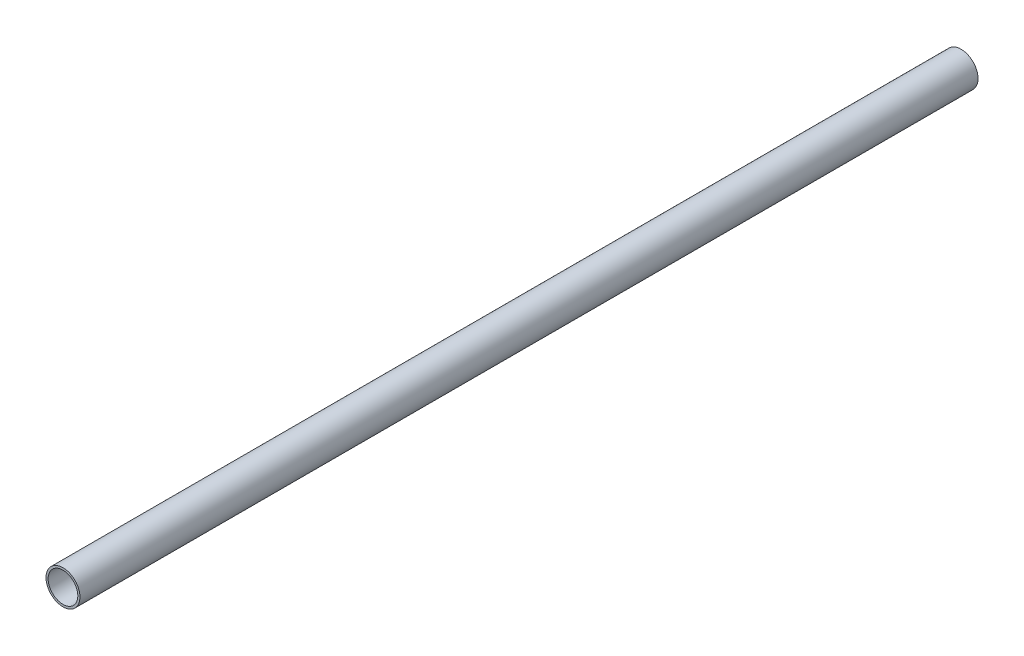
ISO-10303-21;
HEADER;
FILE_DESCRIPTION(('STEP AP214'),'2;1');
FILE_NAME('part.step','',(''),(''),'','','');
FILE_SCHEMA(('AUTOMOTIVE_DESIGN { 1 0 10303 214 1 1 1 1 }'));
ENDSEC;
DATA;
#1=APPLICATION_CONTEXT('core data for automotive mechanical design processes');
#2=APPLICATION_PROTOCOL_DEFINITION('international standard','automotive_design',2000,#1);
#3=PRODUCT_CONTEXT('',#1,'mechanical');
#4=PRODUCT('Part','Part','',(#3));
#5=PRODUCT_RELATED_PRODUCT_CATEGORY('part','',(#4));
#6=PRODUCT_DEFINITION_FORMATION('','',#4);
#7=PRODUCT_DEFINITION_CONTEXT('part definition',#1,'design');
#8=PRODUCT_DEFINITION('design','',#6,#7);
#9=PRODUCT_DEFINITION_SHAPE('','',#8);
#10=(LENGTH_UNIT() NAMED_UNIT(*) SI_UNIT(.MILLI.,.METRE.));
#11=(NAMED_UNIT(*) PLANE_ANGLE_UNIT() SI_UNIT($,.RADIAN.));
#12=(NAMED_UNIT(*) SI_UNIT($,.STERADIAN.) SOLID_ANGLE_UNIT());
#13=UNCERTAINTY_MEASURE_WITH_UNIT(LENGTH_MEASURE(1.E-05),#10,'distance_accuracy_value','');
#14=(GEOMETRIC_REPRESENTATION_CONTEXT(3) GLOBAL_UNCERTAINTY_ASSIGNED_CONTEXT((#13)) GLOBAL_UNIT_ASSIGNED_CONTEXT((#10,
#11,#12)) REPRESENTATION_CONTEXT('',''));
#15=CARTESIAN_POINT('',(0.,0.,0.));
#16=DIRECTION('',(0.,0.,1.));
#17=DIRECTION('',(1.,0.,0.));
#18=AXIS2_PLACEMENT_3D('',#15,#16,#17);
#19=CARTESIAN_POINT('',(0.,0.,210.));
#20=DIRECTION('',(0.,0.,1.));
#21=DIRECTION('',(1.,0.,0.));
#22=AXIS2_PLACEMENT_3D('',#19,#20,#21);
#23=PLANE('',#22);
#24=CARTESIAN_POINT('',(0.,0.,210.));
#25=DIRECTION('',(0.,0.,1.));
#26=DIRECTION('',(1.,0.,0.));
#27=AXIS2_PLACEMENT_3D('',#24,#25,#26);
#28=CIRCLE('',#27,7.9375);
#29=CARTESIAN_POINT('',(-7.9375,0.,210.));
#30=VERTEX_POINT('',#29);
#31=EDGE_CURVE('E10',#30,#30,#28,.T.);
#32=ORIENTED_EDGE('',*,*,#31,.T.);
#33=EDGE_LOOP('',(#32));
#34=FACE_BOUND('',#33,.T.);
#35=CARTESIAN_POINT('',(0.,0.,210.));
#36=DIRECTION('',(0.,0.,1.));
#37=DIRECTION('',(1.,0.,0.));
#38=AXIS2_PLACEMENT_3D('',#35,#36,#37);
#39=CIRCLE('',#38,6.9375);
#40=CARTESIAN_POINT('',(-6.9375,0.,210.));
#41=VERTEX_POINT('',#40);
#42=EDGE_CURVE('E42',#41,#41,#39,.T.);
#43=ORIENTED_EDGE('',*,*,#42,.F.);
#44=EDGE_LOOP('',(#43));
#45=FACE_BOUND('',#44,.T.);
#46=ADVANCED_FACE('F31',(#34,#45),#23,.T.);
#47=CARTESIAN_POINT('',(0.,0.,-210.));
#48=DIRECTION('',(0.,0.,1.));
#49=DIRECTION('',(1.,0.,0.));
#50=AXIS2_PLACEMENT_3D('',#47,#48,#49);
#51=PLANE('',#50);
#52=CARTESIAN_POINT('',(0.,0.,-210.));
#53=DIRECTION('',(0.,0.,1.));
#54=DIRECTION('',(1.,0.,0.));
#55=AXIS2_PLACEMENT_3D('',#52,#53,#54);
#56=CIRCLE('',#55,7.9375);
#57=CARTESIAN_POINT('',(-7.9375,0.,-210.));
#58=VERTEX_POINT('',#57);
#59=EDGE_CURVE('E35',#58,#58,#56,.T.);
#60=ORIENTED_EDGE('',*,*,#59,.F.);
#61=EDGE_LOOP('',(#60));
#62=FACE_BOUND('',#61,.T.);
#63=CARTESIAN_POINT('',(0.,0.,-210.));
#64=DIRECTION('',(0.,0.,1.));
#65=DIRECTION('',(1.,0.,0.));
#66=AXIS2_PLACEMENT_3D('',#63,#64,#65);
#67=CIRCLE('',#66,6.9375);
#68=CARTESIAN_POINT('',(-6.9375,0.,-210.));
#69=VERTEX_POINT('',#68);
#70=EDGE_CURVE('E44',#69,#69,#67,.T.);
#71=ORIENTED_EDGE('',*,*,#70,.T.);
#72=EDGE_LOOP('',(#71));
#73=FACE_BOUND('',#72,.T.);
#74=ADVANCED_FACE('F54',(#62,#73),#51,.F.);
#75=CARTESIAN_POINT('',(0.,0.,210.));
#76=DIRECTION('',(0.,0.,-1.));
#77=DIRECTION('',(-1.,0.,0.));
#78=AXIS2_PLACEMENT_3D('',#75,#76,#77);
#79=CYLINDRICAL_SURFACE('',#78,7.9375);
#80=CARTESIAN_POINT('',(-7.9375,0.,210.));
#81=CARTESIAN_POINT('',(-7.9375,0.,205.625));
#82=CARTESIAN_POINT('',(-7.9375,0.,201.25));
#83=CARTESIAN_POINT('',(-7.9375,0.,192.5));
#84=CARTESIAN_POINT('',(-7.9375,0.,188.125));
#85=CARTESIAN_POINT('',(-7.9375,0.,179.375));
#86=CARTESIAN_POINT('',(-7.9375,0.,175.));
#87=CARTESIAN_POINT('',(-7.9375,0.,166.25));
#88=CARTESIAN_POINT('',(-7.9375,0.,161.875));
#89=CARTESIAN_POINT('',(-7.9375,0.,153.125));
#90=CARTESIAN_POINT('',(-7.9375,0.,148.75));
#91=CARTESIAN_POINT('',(-7.9375,0.,140.));
#92=CARTESIAN_POINT('',(-7.9375,0.,135.625));
#93=CARTESIAN_POINT('',(-7.9375,0.,126.875));
#94=CARTESIAN_POINT('',(-7.9375,0.,122.5));
#95=CARTESIAN_POINT('',(-7.9375,0.,113.75));
#96=CARTESIAN_POINT('',(-7.9375,0.,109.375));
#97=CARTESIAN_POINT('',(-7.9375,0.,100.625));
#98=CARTESIAN_POINT('',(-7.9375,0.,96.25));
#99=CARTESIAN_POINT('',(-7.9375,0.,87.5));
#100=CARTESIAN_POINT('',(-7.9375,0.,83.125));
#101=CARTESIAN_POINT('',(-7.9375,0.,74.375));
#102=CARTESIAN_POINT('',(-7.9375,0.,70.));
#103=CARTESIAN_POINT('',(-7.9375,0.,61.25));
#104=CARTESIAN_POINT('',(-7.9375,0.,56.875));
#105=CARTESIAN_POINT('',(-7.9375,0.,48.125));
#106=CARTESIAN_POINT('',(-7.9375,0.,43.75));
#107=CARTESIAN_POINT('',(-7.9375,0.,35.));
#108=CARTESIAN_POINT('',(-7.9375,0.,30.625));
#109=CARTESIAN_POINT('',(-7.9375,0.,21.875));
#110=CARTESIAN_POINT('',(-7.9375,0.,17.5));
#111=CARTESIAN_POINT('',(-7.9375,0.,8.75));
#112=CARTESIAN_POINT('',(-7.9375,0.,4.375));
#113=CARTESIAN_POINT('',(-7.9375,0.,-4.375));
#114=CARTESIAN_POINT('',(-7.9375,0.,-8.75));
#115=CARTESIAN_POINT('',(-7.9375,0.,-17.5));
#116=CARTESIAN_POINT('',(-7.9375,0.,-21.875));
#117=CARTESIAN_POINT('',(-7.9375,0.,-30.625));
#118=CARTESIAN_POINT('',(-7.9375,0.,-35.));
#119=CARTESIAN_POINT('',(-7.9375,0.,-43.75));
#120=CARTESIAN_POINT('',(-7.9375,0.,-48.125));
#121=CARTESIAN_POINT('',(-7.9375,0.,-56.875));
#122=CARTESIAN_POINT('',(-7.9375,0.,-61.25));
#123=CARTESIAN_POINT('',(-7.9375,0.,-70.));
#124=CARTESIAN_POINT('',(-7.9375,0.,-74.375));
#125=CARTESIAN_POINT('',(-7.9375,0.,-83.125));
#126=CARTESIAN_POINT('',(-7.9375,0.,-87.5));
#127=CARTESIAN_POINT('',(-7.9375,0.,-96.25));
#128=CARTESIAN_POINT('',(-7.9375,0.,-100.625));
#129=CARTESIAN_POINT('',(-7.9375,0.,-109.375));
#130=CARTESIAN_POINT('',(-7.9375,0.,-113.75));
#131=CARTESIAN_POINT('',(-7.9375,0.,-122.5));
#132=CARTESIAN_POINT('',(-7.9375,0.,-126.875));
#133=CARTESIAN_POINT('',(-7.9375,0.,-135.625));
#134=CARTESIAN_POINT('',(-7.9375,0.,-140.));
#135=CARTESIAN_POINT('',(-7.9375,0.,-148.75));
#136=CARTESIAN_POINT('',(-7.9375,0.,-153.125));
#137=CARTESIAN_POINT('',(-7.9375,0.,-161.875));
#138=CARTESIAN_POINT('',(-7.9375,0.,-166.25));
#139=CARTESIAN_POINT('',(-7.9375,0.,-175.));
#140=CARTESIAN_POINT('',(-7.9375,0.,-179.375));
#141=CARTESIAN_POINT('',(-7.9375,0.,-188.125));
#142=CARTESIAN_POINT('',(-7.9375,0.,-192.5));
#143=CARTESIAN_POINT('',(-7.9375,0.,-201.25));
#144=CARTESIAN_POINT('',(-7.9375,0.,-205.625));
#145=CARTESIAN_POINT('',(-7.9375,0.,-210.));
#146=B_SPLINE_CURVE_WITH_KNOTS('',3,(#80,#81,#82,#83,#84,#85,#86,#87,#88,#89,#90,#91,#92,#93,
#94,#95,#96,#97,#98,#99,#100,#101,#102,#103,#104,#105,#106,#107,#108,#109,#110,#111,#112,#113,
#114,#115,#116,#117,#118,#119,#120,#121,#122,#123,#124,#125,#126,#127,#128,#129,#130,#131,#132,
#133,#134,#135,#136,#137,#138,#139,#140,#141,#142,#143,#144,#145),.UNSPECIFIED.,.F.,.F.,(4,2,2,
2,2,2,2,2,2,2,2,2,2,2,2,2,2,2,2,2,2,2,2,2,2,2,2,2,2,2,2,2,4),(0.,13.125,26.25,39.375,52.5,
65.625,78.75,91.8750000000001,105.,118.125,131.25,144.375,157.5,170.625,183.75,196.875,210.,
223.125,236.25,249.375,262.5,275.625,288.75,301.875,315.,328.125,341.25,354.375,367.5,380.625,
393.75,406.875,420.),.UNSPECIFIED.);
#147=EDGE_CURVE('BSEAM33',#30,#58,#146,.T.);
#148=ORIENTED_EDGE('',*,*,#31,.F.);
#149=ORIENTED_EDGE('',*,*,#59,.T.);
#150=ORIENTED_EDGE('',*,*,#147,.T.);
#151=ORIENTED_EDGE('',*,*,#147,.F.);
#152=EDGE_LOOP('',(#148,#150,#149,#151));
#153=FACE_BOUND('',#152,.T.);
#154=ADVANCED_FACE('F33',(#153),#79,.T.);
#155=CARTESIAN_POINT('',(0.,0.,210.));
#156=DIRECTION('',(0.,0.,-1.));
#157=DIRECTION('',(-1.,0.,0.));
#158=AXIS2_PLACEMENT_3D('',#155,#156,#157);
#159=CYLINDRICAL_SURFACE('',#158,6.9375);
#160=CARTESIAN_POINT('',(-6.9375,0.,210.));
#161=CARTESIAN_POINT('',(-6.9375,0.,205.625));
#162=CARTESIAN_POINT('',(-6.9375,0.,201.25));
#163=CARTESIAN_POINT('',(-6.9375,0.,192.5));
#164=CARTESIAN_POINT('',(-6.9375,0.,188.125));
#165=CARTESIAN_POINT('',(-6.9375,0.,179.375));
#166=CARTESIAN_POINT('',(-6.9375,0.,175.));
#167=CARTESIAN_POINT('',(-6.9375,0.,166.25));
#168=CARTESIAN_POINT('',(-6.9375,0.,161.875));
#169=CARTESIAN_POINT('',(-6.9375,0.,153.125));
#170=CARTESIAN_POINT('',(-6.9375,0.,148.75));
#171=CARTESIAN_POINT('',(-6.9375,0.,140.));
#172=CARTESIAN_POINT('',(-6.9375,0.,135.625));
#173=CARTESIAN_POINT('',(-6.9375,0.,126.875));
#174=CARTESIAN_POINT('',(-6.9375,0.,122.5));
#175=CARTESIAN_POINT('',(-6.9375,0.,113.75));
#176=CARTESIAN_POINT('',(-6.9375,0.,109.375));
#177=CARTESIAN_POINT('',(-6.9375,0.,100.625));
#178=CARTESIAN_POINT('',(-6.9375,0.,96.25));
#179=CARTESIAN_POINT('',(-6.9375,0.,87.5));
#180=CARTESIAN_POINT('',(-6.9375,0.,83.125));
#181=CARTESIAN_POINT('',(-6.9375,0.,74.375));
#182=CARTESIAN_POINT('',(-6.9375,0.,70.));
#183=CARTESIAN_POINT('',(-6.9375,0.,61.25));
#184=CARTESIAN_POINT('',(-6.9375,0.,56.875));
#185=CARTESIAN_POINT('',(-6.9375,0.,48.125));
#186=CARTESIAN_POINT('',(-6.9375,0.,43.75));
#187=CARTESIAN_POINT('',(-6.9375,0.,35.));
#188=CARTESIAN_POINT('',(-6.9375,0.,30.625));
#189=CARTESIAN_POINT('',(-6.9375,0.,21.875));
#190=CARTESIAN_POINT('',(-6.9375,0.,17.5));
#191=CARTESIAN_POINT('',(-6.9375,0.,8.74999999999997));
#192=CARTESIAN_POINT('',(-6.9375,0.,4.37499999999997));
#193=CARTESIAN_POINT('',(-6.9375,0.,-4.37500000000003));
#194=CARTESIAN_POINT('',(-6.9375,0.,-8.75000000000003));
#195=CARTESIAN_POINT('',(-6.9375,0.,-17.5));
#196=CARTESIAN_POINT('',(-6.9375,0.,-21.875));
#197=CARTESIAN_POINT('',(-6.9375,0.,-30.625));
#198=CARTESIAN_POINT('',(-6.9375,0.,-35.));
#199=CARTESIAN_POINT('',(-6.9375,0.,-43.75));
#200=CARTESIAN_POINT('',(-6.9375,0.,-48.125));
#201=CARTESIAN_POINT('',(-6.9375,0.,-56.875));
#202=CARTESIAN_POINT('',(-6.9375,0.,-61.25));
#203=CARTESIAN_POINT('',(-6.9375,0.,-70.));
#204=CARTESIAN_POINT('',(-6.9375,0.,-74.375));
#205=CARTESIAN_POINT('',(-6.9375,0.,-83.125));
#206=CARTESIAN_POINT('',(-6.9375,0.,-87.5));
#207=CARTESIAN_POINT('',(-6.9375,0.,-96.25));
#208=CARTESIAN_POINT('',(-6.9375,0.,-100.625));
#209=CARTESIAN_POINT('',(-6.9375,0.,-109.375));
#210=CARTESIAN_POINT('',(-6.9375,0.,-113.75));
#211=CARTESIAN_POINT('',(-6.9375,0.,-122.5));
#212=CARTESIAN_POINT('',(-6.9375,0.,-126.875));
#213=CARTESIAN_POINT('',(-6.9375,0.,-135.625));
#214=CARTESIAN_POINT('',(-6.9375,0.,-140.));
#215=CARTESIAN_POINT('',(-6.9375,0.,-148.75));
#216=CARTESIAN_POINT('',(-6.9375,0.,-153.125));
#217=CARTESIAN_POINT('',(-6.9375,0.,-161.875));
#218=CARTESIAN_POINT('',(-6.9375,0.,-166.25));
#219=CARTESIAN_POINT('',(-6.9375,0.,-175.));
#220=CARTESIAN_POINT('',(-6.9375,0.,-179.375));
#221=CARTESIAN_POINT('',(-6.9375,0.,-188.125));
#222=CARTESIAN_POINT('',(-6.9375,0.,-192.5));
#223=CARTESIAN_POINT('',(-6.9375,0.,-201.25));
#224=CARTESIAN_POINT('',(-6.9375,0.,-205.625));
#225=CARTESIAN_POINT('',(-6.9375,0.,-210.));
#226=B_SPLINE_CURVE_WITH_KNOTS('',3,(#160,#161,#162,#163,#164,#165,#166,#167,#168,#169,#170,
#171,#172,#173,#174,#175,#176,#177,#178,#179,#180,#181,#182,#183,#184,#185,#186,#187,#188,#189,
#190,#191,#192,#193,#194,#195,#196,#197,#198,#199,#200,#201,#202,#203,#204,#205,#206,#207,#208,
#209,#210,#211,#212,#213,#214,#215,#216,#217,#218,#219,#220,#221,#222,#223,#224,#225),
.UNSPECIFIED.,.F.,.F.,(4,2,2,2,2,2,2,2,2,2,2,2,2,2,2,2,2,2,2,2,2,2,2,2,2,2,2,2,2,2,2,2,4),(0.,
13.125,26.25,39.375,52.5,65.625,78.75,91.875,105.,118.125,131.25,144.375,157.5,170.625,183.75,
196.875,210.,223.125,236.25,249.375,262.5,275.625,288.75,301.875,315.,328.125,341.25,354.375,
367.5,380.625,393.75,406.875,420.),.UNSPECIFIED.);
#227=EDGE_CURVE('BSEAM50',#41,#69,#226,.T.);
#228=ORIENTED_EDGE('',*,*,#42,.T.);
#229=ORIENTED_EDGE('',*,*,#70,.F.);
#230=ORIENTED_EDGE('',*,*,#227,.T.);
#231=ORIENTED_EDGE('',*,*,#227,.F.);
#232=EDGE_LOOP('',(#228,#230,#229,#231));
#233=FACE_BOUND('',#232,.T.);
#234=ADVANCED_FACE('F50',(#233),#159,.F.);
#235=CLOSED_SHELL('',(#46,#74,#154,#234));
#236=MANIFOLD_SOLID_BREP('B2',#235);
#237=ADVANCED_BREP_SHAPE_REPRESENTATION('',(#18,#236),#14);
#238=SHAPE_DEFINITION_REPRESENTATION(#9,#237);
ENDSEC;
END-ISO-10303-21;
